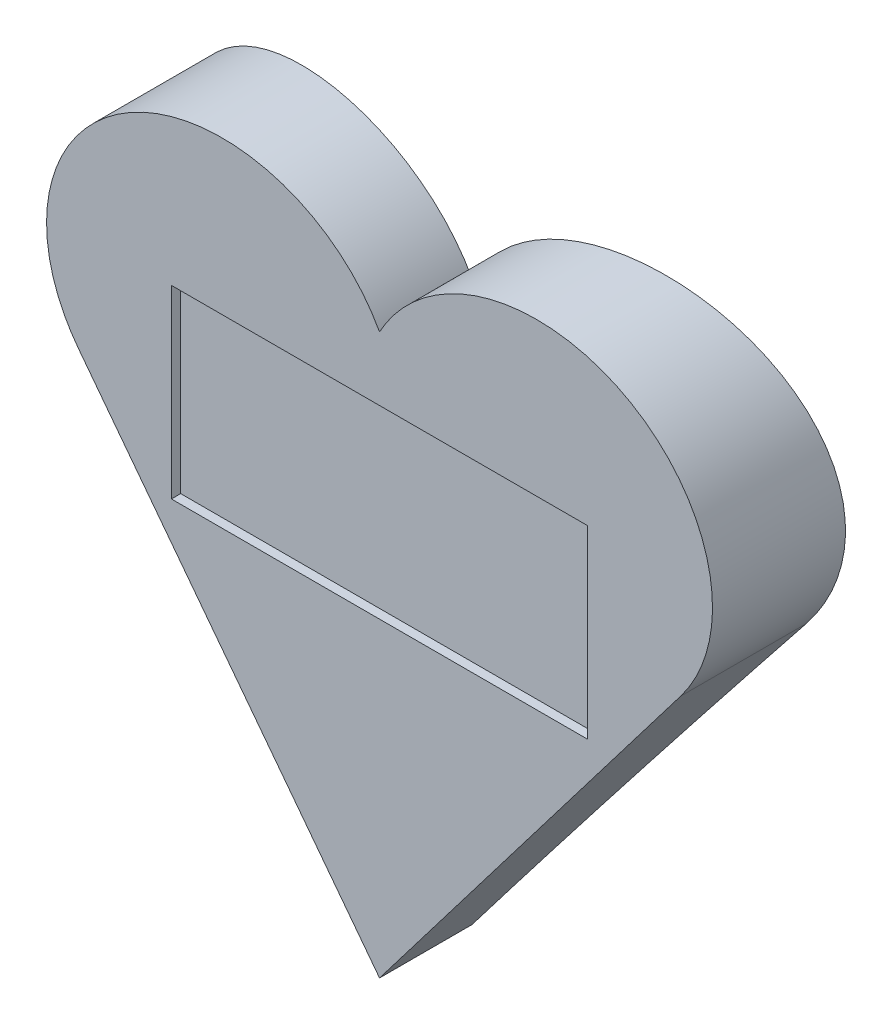
ISO-10303-21;
HEADER;
FILE_DESCRIPTION(('STEP AP214'),'2;1');
FILE_NAME('part.step','',(''),(''),'','','');
FILE_SCHEMA(('AUTOMOTIVE_DESIGN { 1 0 10303 214 1 1 1 1 }'));
ENDSEC;
DATA;
#1=APPLICATION_CONTEXT('core data for automotive mechanical design processes');
#2=APPLICATION_PROTOCOL_DEFINITION('international standard','automotive_design',2000,#1);
#3=PRODUCT_CONTEXT('',#1,'mechanical');
#4=PRODUCT('Part','Part','',(#3));
#5=PRODUCT_RELATED_PRODUCT_CATEGORY('part','',(#4));
#6=PRODUCT_DEFINITION_FORMATION('','',#4);
#7=PRODUCT_DEFINITION_CONTEXT('part definition',#1,'design');
#8=PRODUCT_DEFINITION('design','',#6,#7);
#9=PRODUCT_DEFINITION_SHAPE('','',#8);
#10=(LENGTH_UNIT() NAMED_UNIT(*) SI_UNIT(.MILLI.,.METRE.));
#11=(NAMED_UNIT(*) PLANE_ANGLE_UNIT() SI_UNIT($,.RADIAN.));
#12=(NAMED_UNIT(*) SI_UNIT($,.STERADIAN.) SOLID_ANGLE_UNIT());
#13=UNCERTAINTY_MEASURE_WITH_UNIT(LENGTH_MEASURE(1.E-05),#10,'distance_accuracy_value','');
#14=(GEOMETRIC_REPRESENTATION_CONTEXT(3) GLOBAL_UNCERTAINTY_ASSIGNED_CONTEXT((#13)) GLOBAL_UNIT_ASSIGNED_CONTEXT((#10,
#11,#12)) REPRESENTATION_CONTEXT('',''));
#15=CARTESIAN_POINT('',(0.,0.,0.));
#16=DIRECTION('',(0.,0.,1.));
#17=DIRECTION('',(1.,0.,0.));
#18=AXIS2_PLACEMENT_3D('',#15,#16,#17);
#19=CARTESIAN_POINT('',(-3.40003264943234,2.63808969661327,16.5785832108462));
#20=DIRECTION('',(0.,0.,1.));
#21=DIRECTION('',(-1.,0.,0.));
#22=AXIS2_PLACEMENT_3D('',#19,#20,#21);
#23=ELLIPSE('',#22,3.8,3.49249548237185);
#24=DIRECTION('',(0.,0.,-1.));
#25=VECTOR('',#24,1.);
#26=SURFACE_OF_LINEAR_EXTRUSION('',#23,#25);
#27=DIRECTION('',(0.,0.,-1.));
#28=VECTOR('',#27,1.);
#29=CARTESIAN_POINT('',(-3.26494323392626E-05,4.19781637378075,16.5785832108462));
#30=LINE('',#29,#28);
#31=CARTESIAN_POINT('',(-3.26494323392626E-05,4.19781637378075,16.5785832108462));
#32=VERTEX_POINT('',#31);
#33=CARTESIAN_POINT('',(-3.26494323392626E-05,4.19781637378075,14.5785832108462));
#34=VERTEX_POINT('',#33);
#35=EDGE_CURVE('E182',#32,#34,#30,.T.);
#36=ORIENTED_EDGE('',*,*,#35,.T.);
#37=CARTESIAN_POINT('',(-3.26494323392626E-05,4.19781637378075,14.5785832108462));
#38=CARTESIAN_POINT('',(-0.0472438907606169,4.28477398237098,14.5785826219369));
#39=CARTESIAN_POINT('',(-0.0982768445974168,4.36963675522912,14.5784719359327));
#40=CARTESIAN_POINT('',(-0.207411863028881,4.53463893008514,14.5779166186777));
#41=CARTESIAN_POINT('',(-0.265510957258464,4.6147802959159,14.5774721273434));
#42=CARTESIAN_POINT('',(-0.388233314420987,4.76986561169418,14.5761357595303));
#43=CARTESIAN_POINT('',(-0.452855394456006,4.84481049984321,14.5752439640509));
#44=CARTESIAN_POINT('',(-0.588054620978478,4.98911714449025,14.5728998133028));
#45=CARTESIAN_POINT('',(-0.65863224284683,5.05847845443299,14.5714474132526));
#46=CARTESIAN_POINT('',(-0.80511659806382,5.19123880280898,14.5678751717319));
#47=CARTESIAN_POINT('',(-0.881021227583256,5.25464017215268,14.5657555926148));
#48=CARTESIAN_POINT('',(-1.037592062395,5.37523037808342,14.5607498823143));
#49=CARTESIAN_POINT('',(-1.11825850568658,5.4324189037411,14.5578637127908));
#50=CARTESIAN_POINT('',(-1.28373898625594,5.540337564059,14.5512381814361));
#51=CARTESIAN_POINT('',(-1.36855209936443,5.59106912878374,14.547499009039));
#52=CARTESIAN_POINT('',(-1.54174188689144,5.68589832423473,14.53909436495));
#53=CARTESIAN_POINT('',(-1.63011796589761,5.72999705760385,14.5344290475205));
#54=CARTESIAN_POINT('',(-1.80983645376692,5.81141177517896,14.5241150931132));
#55=CARTESIAN_POINT('',(-1.90117741961319,5.84873100233011,14.5184669288207));
#56=CARTESIAN_POINT('',(-2.08634536199602,5.9165281969537,14.5061429607297));
#57=CARTESIAN_POINT('',(-2.18017398795734,5.94700149168851,14.4994664602414));
#58=CARTESIAN_POINT('',(-2.46641538985058,6.02853829260995,14.4777089061172));
#59=CARTESIAN_POINT('',(-2.66184997602625,6.06893760375211,14.4609966490656));
#60=CARTESIAN_POINT('',(-3.05611825106613,6.12106896258908,14.4232776674365));
#61=CARTESIAN_POINT('',(-3.25495294725659,6.13279236113859,14.4022696492538));
#62=CARTESIAN_POINT('',(-3.56618175928124,6.12879060709286,14.3662328141039));
#63=CARTESIAN_POINT('',(-3.67893343131147,6.12271038507968,14.3525240908178));
#64=CARTESIAN_POINT('',(-3.9033450145283,6.10136512409922,14.3239543134077));
#65=CARTESIAN_POINT('',(-4.01500570846551,6.08610725073234,14.3090941661541));
#66=CARTESIAN_POINT('',(-4.23659900151763,6.04648051463539,14.2783480018832));
#67=CARTESIAN_POINT('',(-4.34653100020183,6.02210855608154,14.2624616378046));
#68=CARTESIAN_POINT('',(-4.563873363709,5.96437512883465,14.2298465332609));
#69=CARTESIAN_POINT('',(-4.67128325293969,5.93101197924579,14.2131176357609));
#70=CARTESIAN_POINT('',(-4.98525250598572,5.81880046559884,14.1625057184026));
#71=CARTESIAN_POINT('',(-5.18727480033593,5.72716134696803,14.1276744234888));
#72=CARTESIAN_POINT('',(-5.5657461732025,5.51483131886156,14.0587359799155));
#73=CARTESIAN_POINT('',(-5.74285385109351,5.39530434176865,14.0246478685175));
#74=CARTESIAN_POINT('',(-6.06666785843692,5.13374422443488,13.9596434960209));
#75=CARTESIAN_POINT('',(-6.2144000892567,4.99300452263112,13.928653455501));
#76=CARTESIAN_POINT('',(-6.47733310864385,4.69554977037483,13.8717576712497));
#77=CARTESIAN_POINT('',(-6.5937998897609,4.54000024018233,13.8456742129985));
#78=CARTESIAN_POINT('',(-6.74526949517912,4.29729358465786,13.8110138617438));
#79=CARTESIAN_POINT('',(-6.7910004580644,4.21696233950622,13.8004205750755));
#80=CARTESIAN_POINT('',(-6.87577854055096,4.05268068138204,13.780602515926));
#81=CARTESIAN_POINT('',(-6.91482734568902,3.96873118780066,13.7713773984103));
#82=CARTESIAN_POINT('',(-6.98443128111566,3.80109247558256,13.7548125278664));
#83=CARTESIAN_POINT('',(-7.01525965736112,3.71752240131755,13.747412980517));
#84=CARTESIAN_POINT('',(-7.07007119032667,3.54796802712265,13.734185199062));
#85=CARTESIAN_POINT('',(-7.09404906908048,3.4619819214788,13.7283581766989));
#86=CARTESIAN_POINT('',(-7.13462187176302,3.28925843654142,13.7184609229413));
#87=CARTESIAN_POINT('',(-7.15130055648449,3.20254188707251,13.7143707773747));
#88=CARTESIAN_POINT('',(-7.17750191758301,3.02793792032796,13.7079317042397));
#89=CARTESIAN_POINT('',(-7.18702215066494,2.94005011369044,13.7055833711837));
#90=CARTESIAN_POINT('',(-7.19879111102501,2.76370085634424,13.7026789018515));
#91=CARTESIAN_POINT('',(-7.20103506583025,2.6752390672553,13.7021239418401));
#92=CARTESIAN_POINT('',(-7.19821140119814,2.49840825427711,13.7028214878796));
#93=CARTESIAN_POINT('',(-7.19314120057653,2.41003927415538,13.7040746320152));
#94=CARTESIAN_POINT('',(-7.17579039602923,2.23453691470235,13.7083512995705));
#95=CARTESIAN_POINT('',(-7.16354871570791,2.14739944621888,13.7113652657906));
#96=CARTESIAN_POINT('',(-7.13201895400717,1.97445186608442,13.7190947686461));
#97=CARTESIAN_POINT('',(-7.11272801323989,1.88864230781633,13.7238109957592));
#98=CARTESIAN_POINT('',(-7.0673128690556,1.71897162932572,13.7348491714109));
#99=CARTESIAN_POINT('',(-7.04118985097236,1.63511017386173,13.7411708414071));
#100=CARTESIAN_POINT('',(-6.98238558003156,1.46984622225642,13.7552963946567));
#101=CARTESIAN_POINT('',(-6.94970288663374,1.38844427076113,13.7631006034635));
#102=CARTESIAN_POINT('',(-6.85999460424419,1.18819704197503,13.7843319984538));
#103=CARTESIAN_POINT('',(-6.79900662552084,1.07118105498022,13.7986095970105));
#104=CARTESIAN_POINT('',(-6.69797374774886,0.901910739616325,13.8218566546538));
#105=CARTESIAN_POINT('',(-6.66274262962646,0.846579624328352,13.8299021988027));
#106=CARTESIAN_POINT('',(-6.58924733505916,0.738078660539603,13.8465341351138));
#107=CARTESIAN_POINT('',(-6.55098409251634,0.684908154139908,13.8551203605788));
#108=CARTESIAN_POINT('',(-6.51127381402292,0.6328611816499,13.8639434457339));
#109=B_SPLINE_CURVE_WITH_KNOTS('',3,(#37,#38,#39,#40,#41,#42,#43,#44,#45,#46,#47,#48,#49,#50,
#51,#52,#53,#54,#55,#56,#57,#58,#59,#60,#61,#62,#63,#64,#65,#66,#67,#68,#69,#70,#71,#72,#73,#74,
#75,#76,#77,#78,#79,#80,#81,#82,#83,#84,#85,#86,#87,#88,#89,#90,#91,#92,#93,#94,#95,#96,#97,#98,
#99,#100,#101,#102,#103,#104,#105,#106,#107,#108),.UNSPECIFIED.,.F.,.F.,(4,2,2,2,2,2,2,2,2,2,2,
2,2,2,2,2,2,2,2,2,2,2,2,2,2,2,2,2,2,2,2,2,2,2,2,4),(0.,0.296720851638966,0.593317400260045,
0.889860259468044,1.18642681163428,1.48287689092835,1.77934179960152,2.07574093361045,
2.37209073959352,2.66829841260108,2.96470765401105,3.56318175634236,4.16183634644458,
4.50273461440207,4.84336706535785,5.184115325778,5.52492733305077,6.19523173360235,
6.84141827015672,7.45777929517297,8.04301727894105,8.3218794278028,8.60067113123353,
8.86851890727292,9.13657249355323,9.40146381011112,9.66644549736315,9.93160094960195,
10.1968499987765,10.4606725600852,10.7246022546092,10.9884861888953,11.252428137056,
11.6495347221156,11.8477085051364,12.0458214856105),.UNSPECIFIED.);
#110=CARTESIAN_POINT('',(-6.51127381402292,0.6328611816499,13.8639434457339));
#111=VERTEX_POINT('',#110);
#112=EDGE_CURVE('E137',#34,#111,#109,.T.);
#113=ORIENTED_EDGE('',*,*,#112,.T.);
#114=DIRECTION('',(0.,0.,-1.));
#115=VECTOR('',#114,1.);
#116=CARTESIAN_POINT('',(-6.51127381402292,0.6328611816499,16.5785832108462));
#117=LINE('',#116,#115);
#118=CARTESIAN_POINT('',(-6.51127381402292,0.6328611816499,16.5785832108462));
#119=VERTEX_POINT('',#118);
#120=EDGE_CURVE('E11',#119,#111,#117,.T.);
#121=ORIENTED_EDGE('',*,*,#120,.F.);
#122=EDGE_CURVE('E173',#32,#119,#23,.T.);
#123=ORIENTED_EDGE('',*,*,#122,.F.);
#124=EDGE_LOOP('',(#36,#113,#121,#123));
#125=FACE_BOUND('',#124,.T.);
#126=ADVANCED_FACE('F36',(#125),#26,.F.);
#127=CARTESIAN_POINT('',(-6.51127381402292,0.6328611816499,16.5785832108462));
#128=DIRECTION('',(0.795011010210532,0.606594999685976,0.));
#129=DIRECTION('',(-0.606594999685976,0.795011010210532,0.));
#130=AXIS2_PLACEMENT_3D('',#127,#128,#129);
#131=PLANE('',#130);
#132=ORIENTED_EDGE('',*,*,#120,.T.);
#133=CARTESIAN_POINT('',(-3.26494323392626E-05,-7.90085310657427,-15.4414167891538));
#134=DIRECTION('',(-0.795011010210532,-0.606594999685976,0.));
#135=DIRECTION('',(0.606594999685976,-0.795011010210532,0.));
#136=AXIS2_PLACEMENT_3D('',#133,#134,#135);
#137=ELLIPSE('',#136,49.4893627800111,30.02);
#138=CARTESIAN_POINT('',(-3.26494323447772E-05,-7.90085310657429,14.5785832108462));
#139=VERTEX_POINT('',#138);
#140=EDGE_CURVE('E149',#111,#139,#137,.F.);
#141=ORIENTED_EDGE('',*,*,#140,.T.);
#142=DIRECTION('',(0.,0.,-1.));
#143=VECTOR('',#142,1.);
#144=CARTESIAN_POINT('',(-3.26494323392626E-05,-7.90085310657428,16.5785832108462));
#145=LINE('',#144,#143);
#146=CARTESIAN_POINT('',(-3.26494323392626E-05,-7.90085310657428,16.5785832108462));
#147=VERTEX_POINT('',#146);
#148=EDGE_CURVE('E44',#147,#139,#145,.T.);
#149=ORIENTED_EDGE('',*,*,#148,.F.);
#150=DIRECTION('',(0.606594999685976,-0.795011010210532,0.));
#151=VECTOR('',#150,1.);
#152=CARTESIAN_POINT('',(-6.51127381402292,0.6328611816499,16.5785832108462));
#153=LINE('',#152,#151);
#154=EDGE_CURVE('E176',#119,#147,#153,.T.);
#155=ORIENTED_EDGE('',*,*,#154,.F.);
#156=EDGE_LOOP('',(#132,#141,#149,#155));
#157=FACE_BOUND('',#156,.T.);
#158=ADVANCED_FACE('F190',(#157),#131,.F.);
#159=CARTESIAN_POINT('',(-3.26494323392626E-05,-7.90085310657428,16.5785832108462));
#160=DIRECTION('',(-0.795011010210532,0.606594999685976,0.));
#161=DIRECTION('',(-0.606594999685976,-0.795011010210532,0.));
#162=AXIS2_PLACEMENT_3D('',#159,#160,#161);
#163=PLANE('',#162);
#164=ORIENTED_EDGE('',*,*,#148,.T.);
#165=CARTESIAN_POINT('',(-3.26494323392626E-05,-7.90085310657428,-15.4414167891538));
#166=DIRECTION('',(0.795011010210532,-0.606594999685976,0.));
#167=DIRECTION('',(-0.606594999685976,-0.795011010210532,0.));
#168=AXIS2_PLACEMENT_3D('',#165,#166,#167);
#169=ELLIPSE('',#168,49.4893627800111,30.02);
#170=CARTESIAN_POINT('',(6.51120851515824,0.6328611816499,13.8639434457339));
#171=VERTEX_POINT('',#170);
#172=EDGE_CURVE('E170',#139,#171,#169,.F.);
#173=ORIENTED_EDGE('',*,*,#172,.T.);
#174=DIRECTION('',(0.,0.,-1.));
#175=VECTOR('',#174,1.);
#176=CARTESIAN_POINT('',(6.51120851515824,0.6328611816499,16.5785832108462));
#177=LINE('',#176,#175);
#178=CARTESIAN_POINT('',(6.51120851515824,0.6328611816499,16.5785832108462));
#179=VERTEX_POINT('',#178);
#180=EDGE_CURVE('E208',#179,#171,#177,.T.);
#181=ORIENTED_EDGE('',*,*,#180,.F.);
#182=DIRECTION('',(0.606594999685976,0.795011010210532,0.));
#183=VECTOR('',#182,1.);
#184=CARTESIAN_POINT('',(-3.26494323392626E-05,-7.90085310657428,16.5785832108462));
#185=LINE('',#184,#183);
#186=EDGE_CURVE('E178',#147,#179,#185,.T.);
#187=ORIENTED_EDGE('',*,*,#186,.F.);
#188=EDGE_LOOP('',(#164,#173,#181,#187));
#189=FACE_BOUND('',#188,.T.);
#190=ADVANCED_FACE('F187',(#189),#163,.F.);
#191=CARTESIAN_POINT('',(3.39996735056766,2.63808969661327,16.5785832108462));
#192=DIRECTION('',(0.,0.,1.));
#193=DIRECTION('',(-1.,0.,0.));
#194=AXIS2_PLACEMENT_3D('',#191,#192,#193);
#195=ELLIPSE('',#194,3.8,3.49249548237185);
#196=DIRECTION('',(0.,0.,-1.));
#197=VECTOR('',#196,1.);
#198=SURFACE_OF_LINEAR_EXTRUSION('',#195,#197);
#199=ORIENTED_EDGE('',*,*,#180,.T.);
#200=CARTESIAN_POINT('',(6.51120851515824,0.6328611816499,13.8639434457339));
#201=CARTESIAN_POINT('',(6.56723391941357,0.706273039204706,13.8514950684654));
#202=CARTESIAN_POINT('',(6.62039125141314,0.781972140504563,13.8395158742991));
#203=CARTESIAN_POINT('',(6.72055632575375,0.937584072144098,13.8166885945356));
#204=CARTESIAN_POINT('',(6.76755896012642,1.01750032622338,13.8058414499568));
#205=CARTESIAN_POINT('',(6.8547049065378,1.18068436940706,13.7855393584786));
#206=CARTESIAN_POINT('',(6.89487899290806,1.26393491293163,13.776078193556));
#207=CARTESIAN_POINT('',(6.96819633853616,1.43357295295729,13.7586791735852));
#208=CARTESIAN_POINT('',(7.00134381536256,1.51995853104175,13.7507404050265));
#209=CARTESIAN_POINT('',(7.05995346541765,1.69440868728054,13.736621171515));
#210=CARTESIAN_POINT('',(7.08549441582996,1.78244523792907,13.730422724323));
#211=CARTESIAN_POINT('',(7.12909247466935,1.96051715041625,13.7197983329383));
#212=CARTESIAN_POINT('',(7.14714316759864,2.0505541564253,13.7153739083268));
#213=CARTESIAN_POINT('',(7.18841916655118,2.31463077231584,13.7052370372078));
#214=CARTESIAN_POINT('',(7.20138420215234,2.49049136424343,13.7020215844133));
#215=CARTESIAN_POINT('',(7.19830408507533,2.84193551950744,13.7027824344583));
#216=CARTESIAN_POINT('',(7.18226064207419,3.01751909855978,13.7067583134611));
#217=CARTESIAN_POINT('',(7.13730081803673,3.2756533503222,13.7177852148293));
#218=CARTESIAN_POINT('',(7.11901338748006,3.36030100494922,13.7222604065414));
#219=CARTESIAN_POINT('',(7.075804765214,3.52772665253304,13.7327743664883));
#220=CARTESIAN_POINT('',(7.0508894624532,3.6105062348089,13.7388117465695));
#221=CARTESIAN_POINT('',(6.99466573859539,3.77374656313105,13.7523398463555));
#222=CARTESIAN_POINT('',(6.96335643112006,3.85420698591383,13.7598307675526));
#223=CARTESIAN_POINT('',(6.89464635222456,4.0123494872275,13.7761301386967));
#224=CARTESIAN_POINT('',(6.85724509849808,4.0900313451819,13.7849386929577));
#225=CARTESIAN_POINT('',(6.77671038333421,4.242155531557,13.8037171689304));
#226=CARTESIAN_POINT('',(6.73358050492687,4.31659984661182,13.8136863642292));
#227=CARTESIAN_POINT('',(6.64191989652221,4.46196960610122,13.8346328070856));
#228=CARTESIAN_POINT('',(6.59338632949683,4.53289317356321,13.8456105836317));
#229=CARTESIAN_POINT('',(6.43928629171468,4.74116666392186,13.8800207602811));
#230=CARTESIAN_POINT('',(6.32594789073222,4.87265549638659,13.9047575500764));
#231=CARTESIAN_POINT('',(6.08188044938708,5.11791164425683,13.9563087712148));
#232=CARTESIAN_POINT('',(5.95114154247316,5.23166882529466,13.9831243776738));
#233=CARTESIAN_POINT('',(5.73287149980578,5.39661205286682,14.0262087713129));
#234=CARTESIAN_POINT('',(5.65000004255702,5.45413694501814,14.0422228262658));
#235=CARTESIAN_POINT('',(5.48005877222717,5.56241886591185,14.0742820426124));
#236=CARTESIAN_POINT('',(5.39299244584187,5.61318138763922,14.0903271678856));
#237=CARTESIAN_POINT('',(5.1262541285827,5.7551199327893,14.1382063229012));
#238=CARTESIAN_POINT('',(4.94095202978784,5.83601499404186,14.169802282987));
#239=CARTESIAN_POINT('',(4.56005158410844,5.96912530034825,14.2308465728512));
#240=CARTESIAN_POINT('',(4.36445448972227,6.02134402539322,14.2602951628455));
#241=CARTESIAN_POINT('',(4.06674719028853,6.07766182255127,14.3020161791763));
#242=CARTESIAN_POINT('',(3.96678135031134,6.09276649951018,14.3155159175868));
#243=CARTESIAN_POINT('',(3.76581263474708,6.11560809095325,14.3416167487064));
#244=CARTESIAN_POINT('',(3.66480898755055,6.12333905129872,14.3542171076012));
#245=CARTESIAN_POINT('',(3.35896983149536,6.13544646573938,14.3907776472819));
#246=CARTESIAN_POINT('',(3.15338345648032,6.12834429697375,14.4132051275149));
#247=CARTESIAN_POINT('',(2.74509558739877,6.08351628328461,14.4535117078548));
#248=CARTESIAN_POINT('',(2.54239415695813,6.04578976401937,14.4713907077937));
#249=CARTESIAN_POINT('',(2.2338190815982,5.9637288595195,14.4955591607292));
#250=CARTESIAN_POINT('',(2.12518476541376,5.92989573904567,14.5034557257744));
#251=CARTESIAN_POINT('',(1.91116459106049,5.85310727959125,14.5178754658291));
#252=CARTESIAN_POINT('',(1.80577617472554,5.81015934639982,14.5243997473021));
#253=CARTESIAN_POINT('',(1.60564524115507,5.71831840782353,14.5357679378982));
#254=CARTESIAN_POINT('',(1.5106524496052,5.6699793388605,14.540692485005));
#255=CARTESIAN_POINT('',(1.3249133675799,5.5656082037209,14.5494744967147));
#256=CARTESIAN_POINT('',(1.23416762202575,5.50957515396936,14.5533318246971));
#257=CARTESIAN_POINT('',(1.06091859758923,5.39225781917304,14.5599502191394));
#258=CARTESIAN_POINT('',(0.978235058949684,5.33124164060781,14.5627463156875));
#259=CARTESIAN_POINT('',(0.818180056761518,5.20257601356929,14.5675374897997));
#260=CARTESIAN_POINT('',(0.740807964295545,5.13492735274582,14.5695326623357));
#261=CARTESIAN_POINT('',(0.600988369032321,5.00185199923805,14.5726376038591));
#262=CARTESIAN_POINT('',(0.537864897565784,4.93713596753442,14.5738249821614));
#263=CARTESIAN_POINT('',(0.416697698789449,4.80311535908141,14.5757517324877));
#264=CARTESIAN_POINT('',(0.358653259081632,4.73381142824555,14.5764911674278));
#265=CARTESIAN_POINT('',(0.246722141701509,4.58917496577276,14.5776225747496));
#266=CARTESIAN_POINT('',(0.192972317381008,4.51373627786666,14.578005582398));
#267=CARTESIAN_POINT('',(0.0916866565468986,4.35874896097486,14.5784857195989));
#268=CARTESIAN_POINT('',(0.0441536682065283,4.27919847133688,14.578582718555));
#269=CARTESIAN_POINT('',(-3.26494323193133E-05,4.19781637378079,14.5785832108462));
#270=B_SPLINE_CURVE_WITH_KNOTS('',3,(#200,#201,#202,#203,#204,#205,#206,#207,#208,#209,#210,
#211,#212,#213,#214,#215,#216,#217,#218,#219,#220,#221,#222,#223,#224,#225,#226,#227,#228,#229,
#230,#231,#232,#233,#234,#235,#236,#237,#238,#239,#240,#241,#242,#243,#244,#245,#246,#247,#248,
#249,#250,#251,#252,#253,#254,#255,#256,#257,#258,#259,#260,#261,#262,#263,#264,#265,#266,#267,
#268,#269),.UNSPECIFIED.,.F.,.F.,(4,2,2,2,2,2,2,2,2,2,2,2,2,2,2,2,2,2,2,2,2,2,2,2,2,2,2,2,2,2,2,
2,2,2,4),(0.,0.279499273257876,0.559229060674276,0.837662686319767,1.11592871207389,
1.39120374619364,1.66671407251551,2.19315160532078,2.71955811241012,2.97946650483115,
3.23914473223892,3.49885898238905,3.75859380441467,4.01816693083724,4.27787698596203,
4.80191632701413,5.32625408847011,5.63239571549592,5.93828713133489,6.54972898634546,
7.16109662397044,7.46684909546064,7.77284824787501,8.39118622921416,9.00953782659452,
9.3513414118039,9.69286833744978,10.0126111116584,10.3323947989261,10.6404453008097,
10.9484592639297,11.2194422498261,11.4903871658229,11.76797591981,12.0456914057728),.UNSPECIFIED.);
#271=EDGE_CURVE('E163',#171,#34,#270,.T.);
#272=ORIENTED_EDGE('',*,*,#271,.T.);
#273=ORIENTED_EDGE('',*,*,#35,.F.);
#274=EDGE_CURVE('E59',#179,#32,#195,.T.);
#275=ORIENTED_EDGE('',*,*,#274,.F.);
#276=EDGE_LOOP('',(#199,#272,#273,#275));
#277=FACE_BOUND('',#276,.T.);
#278=ADVANCED_FACE('F184',(#277),#198,.F.);
#279=CARTESIAN_POINT('',(-3.40003264943234,2.63808969661327,16.5785832108462));
#280=DIRECTION('',(0.,0.,1.));
#281=DIRECTION('',(1.,0.,0.));
#282=AXIS2_PLACEMENT_3D('',#279,#280,#281);
#283=PLANE('',#282);
#284=DIRECTION('',(0.,-1.,0.));
#285=VECTOR('',#284,1.);
#286=CARTESIAN_POINT('',(-4.50003264943234,-1.18016091144377,16.5785832108462));
#287=LINE('',#286,#285);
#288=CARTESIAN_POINT('',(-4.50003264943234,2.81983908855623,16.5785832108462));
#289=VERTEX_POINT('',#288);
#290=CARTESIAN_POINT('',(-4.50003264943234,-1.18016091144377,16.5785832108462));
#291=VERTEX_POINT('',#290);
#292=EDGE_CURVE('E51',#289,#291,#287,.T.);
#293=ORIENTED_EDGE('',*,*,#292,.F.);
#294=DIRECTION('',(-1.,0.,0.));
#295=VECTOR('',#294,1.);
#296=CARTESIAN_POINT('',(-4.50003264943234,2.81983908855623,16.5785832108462));
#297=LINE('',#296,#295);
#298=CARTESIAN_POINT('',(4.49996735056766,2.81983908855623,16.5785832108462));
#299=VERTEX_POINT('',#298);
#300=EDGE_CURVE('E122',#299,#289,#297,.T.);
#301=ORIENTED_EDGE('',*,*,#300,.F.);
#302=DIRECTION('',(0.,1.,0.));
#303=VECTOR('',#302,1.);
#304=CARTESIAN_POINT('',(4.49996735056766,-1.18016091144377,16.5785832108462));
#305=LINE('',#304,#303);
#306=CARTESIAN_POINT('',(4.49996735056766,-1.18016091144377,16.5785832108462));
#307=VERTEX_POINT('',#306);
#308=EDGE_CURVE('E125',#307,#299,#305,.T.);
#309=ORIENTED_EDGE('',*,*,#308,.F.);
#310=DIRECTION('',(1.,0.,0.));
#311=VECTOR('',#310,1.);
#312=CARTESIAN_POINT('',(-4.50003264943234,-1.18016091144377,16.5785832108462));
#313=LINE('',#312,#311);
#314=EDGE_CURVE('E131',#291,#307,#313,.T.);
#315=ORIENTED_EDGE('',*,*,#314,.F.);
#316=EDGE_LOOP('',(#293,#301,#309,#315));
#317=FACE_BOUND('',#316,.T.);
#318=ORIENTED_EDGE('',*,*,#122,.T.);
#319=ORIENTED_EDGE('',*,*,#154,.T.);
#320=ORIENTED_EDGE('',*,*,#186,.T.);
#321=ORIENTED_EDGE('',*,*,#274,.T.);
#322=EDGE_LOOP('',(#318,#319,#320,#321));
#323=FACE_BOUND('',#322,.T.);
#324=ADVANCED_FACE('F159',(#317,#323),#283,.T.);
#325=CARTESIAN_POINT('',(-3.26494323392626E-05,-20.8544057857586,-15.4414167891538));
#326=DIRECTION('',(0.,1.,0.));
#327=DIRECTION('',(0.,0.,1.));
#328=AXIS2_PLACEMENT_3D('',#325,#326,#327);
#329=CYLINDRICAL_SURFACE('',#328,30.02);
#330=ORIENTED_EDGE('',*,*,#271,.F.);
#331=ORIENTED_EDGE('',*,*,#172,.F.);
#332=ORIENTED_EDGE('',*,*,#140,.F.);
#333=ORIENTED_EDGE('',*,*,#112,.F.);
#334=EDGE_LOOP('',(#330,#331,#332,#333));
#335=FACE_BOUND('',#334,.T.);
#336=ADVANCED_FACE('F205',(#335),#329,.F.);
#337=CARTESIAN_POINT('',(-4.50003264943234,-1.18016091144377,16.3785832108462));
#338=DIRECTION('',(-1.,0.,0.));
#339=DIRECTION('',(0.,0.,1.));
#340=AXIS2_PLACEMENT_3D('',#337,#338,#339);
#341=PLANE('',#340);
#342=ORIENTED_EDGE('',*,*,#292,.T.);
#343=DIRECTION('',(0.,0.,1.));
#344=VECTOR('',#343,1.);
#345=CARTESIAN_POINT('',(-4.50003264943234,-1.18016091144377,16.3785832108462));
#346=LINE('',#345,#344);
#347=CARTESIAN_POINT('',(-4.50003264943234,-1.18016091144377,16.3785832108462));
#348=VERTEX_POINT('',#347);
#349=EDGE_CURVE('E100',#348,#291,#346,.T.);
#350=ORIENTED_EDGE('',*,*,#349,.F.);
#351=DIRECTION('',(0.,-1.,0.));
#352=VECTOR('',#351,1.);
#353=CARTESIAN_POINT('',(-4.50003264943234,-1.18016091144377,16.3785832108462));
#354=LINE('',#353,#352);
#355=CARTESIAN_POINT('',(-4.50003264943234,2.81983908855623,16.3785832108462));
#356=VERTEX_POINT('',#355);
#357=EDGE_CURVE('E104',#356,#348,#354,.T.);
#358=ORIENTED_EDGE('',*,*,#357,.F.);
#359=DIRECTION('',(0.,0.,1.));
#360=VECTOR('',#359,1.);
#361=CARTESIAN_POINT('',(-4.50003264943234,2.81983908855623,16.3785832108462));
#362=LINE('',#361,#360);
#363=EDGE_CURVE('E135',#356,#289,#362,.T.);
#364=ORIENTED_EDGE('',*,*,#363,.T.);
#365=EDGE_LOOP('',(#342,#350,#358,#364));
#366=FACE_BOUND('',#365,.T.);
#367=ADVANCED_FACE('F102',(#366),#341,.F.);
#368=CARTESIAN_POINT('',(-4.50003264943234,2.81983908855623,16.3785832108462));
#369=DIRECTION('',(0.,1.,0.));
#370=DIRECTION('',(0.,0.,1.));
#371=AXIS2_PLACEMENT_3D('',#368,#369,#370);
#372=PLANE('',#371);
#373=ORIENTED_EDGE('',*,*,#300,.T.);
#374=ORIENTED_EDGE('',*,*,#363,.F.);
#375=DIRECTION('',(-1.,0.,0.));
#376=VECTOR('',#375,1.);
#377=CARTESIAN_POINT('',(-4.50003264943234,2.81983908855623,16.3785832108462));
#378=LINE('',#377,#376);
#379=CARTESIAN_POINT('',(4.49996735056766,2.81983908855623,16.3785832108462));
#380=VERTEX_POINT('',#379);
#381=EDGE_CURVE('E110',#380,#356,#378,.T.);
#382=ORIENTED_EDGE('',*,*,#381,.F.);
#383=DIRECTION('',(0.,0.,1.));
#384=VECTOR('',#383,1.);
#385=CARTESIAN_POINT('',(4.49996735056766,2.81983908855623,16.3785832108462));
#386=LINE('',#385,#384);
#387=EDGE_CURVE('E138',#380,#299,#386,.T.);
#388=ORIENTED_EDGE('',*,*,#387,.T.);
#389=EDGE_LOOP('',(#373,#374,#382,#388));
#390=FACE_BOUND('',#389,.T.);
#391=ADVANCED_FACE('F220',(#390),#372,.F.);
#392=CARTESIAN_POINT('',(4.49996735056766,-1.18016091144377,16.3785832108462));
#393=DIRECTION('',(1.,0.,0.));
#394=DIRECTION('',(0.,0.,-1.));
#395=AXIS2_PLACEMENT_3D('',#392,#393,#394);
#396=PLANE('',#395);
#397=ORIENTED_EDGE('',*,*,#308,.T.);
#398=ORIENTED_EDGE('',*,*,#387,.F.);
#399=DIRECTION('',(0.,1.,0.));
#400=VECTOR('',#399,1.);
#401=CARTESIAN_POINT('',(4.49996735056766,-1.18016091144377,16.3785832108462));
#402=LINE('',#401,#400);
#403=CARTESIAN_POINT('',(4.49996735056766,-1.18016091144377,16.3785832108462));
#404=VERTEX_POINT('',#403);
#405=EDGE_CURVE('E118',#404,#380,#402,.T.);
#406=ORIENTED_EDGE('',*,*,#405,.F.);
#407=DIRECTION('',(0.,0.,1.));
#408=VECTOR('',#407,1.);
#409=CARTESIAN_POINT('',(4.49996735056766,-1.18016091144377,16.3785832108462));
#410=LINE('',#409,#408);
#411=EDGE_CURVE('E109',#404,#307,#410,.T.);
#412=ORIENTED_EDGE('',*,*,#411,.T.);
#413=EDGE_LOOP('',(#397,#398,#406,#412));
#414=FACE_BOUND('',#413,.T.);
#415=ADVANCED_FACE('F218',(#414),#396,.F.);
#416=CARTESIAN_POINT('',(-4.50003264943234,-1.18016091144377,16.3785832108462));
#417=DIRECTION('',(0.,-1.,0.));
#418=DIRECTION('',(0.,0.,-1.));
#419=AXIS2_PLACEMENT_3D('',#416,#417,#418);
#420=PLANE('',#419);
#421=ORIENTED_EDGE('',*,*,#314,.T.);
#422=ORIENTED_EDGE('',*,*,#411,.F.);
#423=DIRECTION('',(1.,0.,0.));
#424=VECTOR('',#423,1.);
#425=CARTESIAN_POINT('',(-4.50003264943234,-1.18016091144377,16.3785832108462));
#426=LINE('',#425,#424);
#427=EDGE_CURVE('E113',#348,#404,#426,.T.);
#428=ORIENTED_EDGE('',*,*,#427,.F.);
#429=ORIENTED_EDGE('',*,*,#349,.T.);
#430=EDGE_LOOP('',(#421,#422,#428,#429));
#431=FACE_BOUND('',#430,.T.);
#432=ADVANCED_FACE('F114',(#431),#420,.F.);
#433=CARTESIAN_POINT('',(-3.26494323392626E-05,-0.854405785758582,16.3785832108462));
#434=DIRECTION('',(0.,0.,-1.));
#435=DIRECTION('',(-1.,0.,0.));
#436=AXIS2_PLACEMENT_3D('',#433,#434,#435);
#437=PLANE('',#436);
#438=ORIENTED_EDGE('',*,*,#357,.T.);
#439=ORIENTED_EDGE('',*,*,#427,.T.);
#440=ORIENTED_EDGE('',*,*,#405,.T.);
#441=ORIENTED_EDGE('',*,*,#381,.T.);
#442=EDGE_LOOP('',(#438,#439,#440,#441));
#443=FACE_BOUND('',#442,.T.);
#444=ADVANCED_FACE('F120',(#443),#437,.F.);
#445=CLOSED_SHELL('',(#126,#158,#190,#278,#324,#336,#367,#391,#415,#432,#444));
#446=MANIFOLD_SOLID_BREP('B2',#445);
#447=ADVANCED_BREP_SHAPE_REPRESENTATION('',(#18,#446),#14);
#448=SHAPE_DEFINITION_REPRESENTATION(#9,#447);
ENDSEC;
END-ISO-10303-21;
